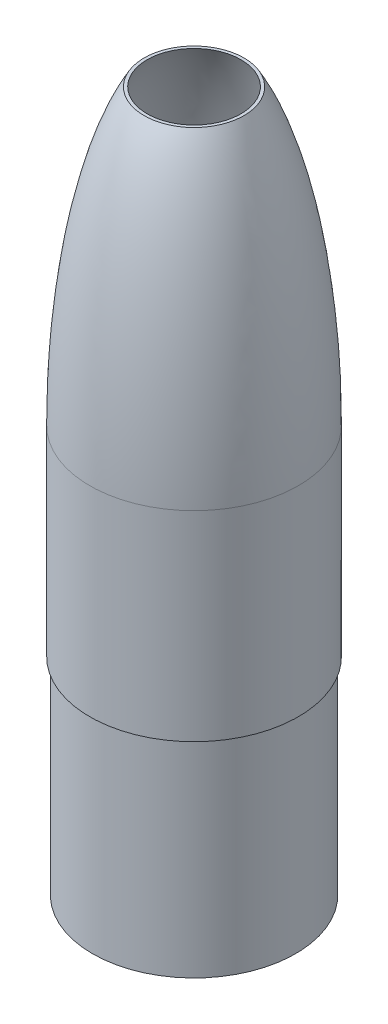
ISO-10303-21;
HEADER;
FILE_DESCRIPTION(('STEP AP214'),'2;1');
FILE_NAME('part.step','',(''),(''),'','','');
FILE_SCHEMA(('AUTOMOTIVE_DESIGN { 1 0 10303 214 1 1 1 1 }'));
ENDSEC;
DATA;
#1=APPLICATION_CONTEXT('core data for automotive mechanical design processes');
#2=APPLICATION_PROTOCOL_DEFINITION('international standard','automotive_design',2000,#1);
#3=PRODUCT_CONTEXT('',#1,'mechanical');
#4=PRODUCT('Part','Part','',(#3));
#5=PRODUCT_RELATED_PRODUCT_CATEGORY('part','',(#4));
#6=PRODUCT_DEFINITION_FORMATION('','',#4);
#7=PRODUCT_DEFINITION_CONTEXT('part definition',#1,'design');
#8=PRODUCT_DEFINITION('design','',#6,#7);
#9=PRODUCT_DEFINITION_SHAPE('','',#8);
#10=(LENGTH_UNIT() NAMED_UNIT(*) SI_UNIT(.MILLI.,.METRE.));
#11=(NAMED_UNIT(*) PLANE_ANGLE_UNIT() SI_UNIT($,.RADIAN.));
#12=(NAMED_UNIT(*) SI_UNIT($,.STERADIAN.) SOLID_ANGLE_UNIT());
#13=UNCERTAINTY_MEASURE_WITH_UNIT(LENGTH_MEASURE(1.E-05),#10,'distance_accuracy_value','');
#14=(GEOMETRIC_REPRESENTATION_CONTEXT(3) GLOBAL_UNCERTAINTY_ASSIGNED_CONTEXT((#13)) GLOBAL_UNIT_ASSIGNED_CONTEXT((#10,
#11,#12)) REPRESENTATION_CONTEXT('',''));
#15=CARTESIAN_POINT('',(0.,0.,0.));
#16=DIRECTION('',(0.,0.,1.));
#17=DIRECTION('',(1.,0.,0.));
#18=AXIS2_PLACEMENT_3D('',#15,#16,#17);
#19=CARTESIAN_POINT('',(78.16,150.,0.));
#20=CARTESIAN_POINT('',(78.16,158.124741440831,0.));
#21=CARTESIAN_POINT('',(77.9143964283696,174.415956202879,0.));
#22=CARTESIAN_POINT('',(76.8126900292029,198.585734280331,0.));
#23=CARTESIAN_POINT('',(74.987978239891,222.299614595278,0.));
#24=CARTESIAN_POINT('',(71.6143857103054,252.993821618781,0.));
#25=CARTESIAN_POINT('',(65.6897649255414,289.080732547851,0.));
#26=CARTESIAN_POINT('',(56.1093429123413,327.087146411559,0.));
#27=CARTESIAN_POINT('',(44.4035725024656,358.368758891952,0.));
#28=CARTESIAN_POINT('',(33.2071437767828,377.875372885673,0.));
#29=CARTESIAN_POINT('',(23.5506825278786,389.130576689322,0.));
#30=CARTESIAN_POINT('',(15.9852093641942,395.313409978409,0.));
#31=CARTESIAN_POINT('',(8.09536320832362,399.131102802521,0.));
#32=CARTESIAN_POINT('',(2.72314978418837,400.,0.));
#33=CARTESIAN_POINT('',(0.,400.,0.));
#34=B_SPLINE_CURVE_WITH_KNOTS('',3,(#19,#20,#21,#22,#23,#24,#25,#26,#27,#28,#29,#30,#31,#32,
#33),.UNSPECIFIED.,.F.,.F.,(4,1,1,1,1,1,1,1,1,1,1,1,4),(-1.5707963267949,-1.47262155637022,
-1.37444678594553,-1.27627201552085,-1.17809724509617,-0.98174770424681,-0.785398163397448,
-0.589048622548086,-0.392699081698724,-0.294524311274043,-0.196349540849362,-0.0981747704246811,
0.),.UNSPECIFIED.);
#35=CARTESIAN_POINT('',(0.,0.,0.));
#36=DIRECTION('',(0.,-1.,0.));
#37=AXIS1_PLACEMENT('',#35,#36);
#38=SURFACE_OF_REVOLUTION('',#34,#37);
#39=CARTESIAN_POINT('',(0.,370.,0.));
#40=DIRECTION('',(0.,-1.,0.));
#41=DIRECTION('',(0.,0.,-1.));
#42=AXIS2_PLACEMENT_3D('',#39,#40,#41);
#43=CIRCLE('',#42,37.4634477047783);
#44=CARTESIAN_POINT('',(0.,370.,-37.4634477047783));
#45=VERTEX_POINT('',#44);
#46=EDGE_CURVE('E97',#45,#45,#43,.F.);
#47=ORIENTED_EDGE('',*,*,#46,.F.);
#48=EDGE_LOOP('',(#47));
#49=FACE_BOUND('',#48,.T.);
#50=CARTESIAN_POINT('',(0.,150.,0.));
#51=DIRECTION('',(0.,-1.,0.));
#52=DIRECTION('',(0.,0.,-1.));
#53=AXIS2_PLACEMENT_3D('',#50,#51,#52);
#54=CIRCLE('',#53,78.16);
#55=CARTESIAN_POINT('',(0.,150.,-78.16));
#56=VERTEX_POINT('',#55);
#57=EDGE_CURVE('E46',#56,#56,#54,.T.);
#58=ORIENTED_EDGE('',*,*,#57,.F.);
#59=EDGE_LOOP('',(#58));
#60=FACE_BOUND('',#59,.T.);
#61=ADVANCED_FACE('F34',(#49,#60),#38,.F.);
#62=CARTESIAN_POINT('',(76.2,0.,0.));
#63=DIRECTION('',(0.,-1.,0.));
#64=DIRECTION('',(0.,0.,-1.));
#65=AXIS2_PLACEMENT_3D('',#62,#63,#64);
#66=PLANE('',#65);
#67=CARTESIAN_POINT('',(0.,0.,0.));
#68=DIRECTION('',(0.,-1.,0.));
#69=DIRECTION('',(0.,0.,-1.));
#70=AXIS2_PLACEMENT_3D('',#67,#68,#69);
#71=CIRCLE('',#70,78.16);
#72=CARTESIAN_POINT('',(0.,0.,-78.16));
#73=VERTEX_POINT('',#72);
#74=EDGE_CURVE('E42',#73,#73,#71,.T.);
#75=ORIENTED_EDGE('',*,*,#74,.T.);
#76=EDGE_LOOP('',(#75));
#77=FACE_BOUND('',#76,.T.);
#78=CARTESIAN_POINT('',(0.,0.,0.));
#79=DIRECTION('',(0.,-1.,0.));
#80=DIRECTION('',(0.,0.,-1.));
#81=AXIS2_PLACEMENT_3D('',#78,#79,#80);
#82=CIRCLE('',#81,76.2);
#83=CARTESIAN_POINT('',(0.,0.,76.2));
#84=VERTEX_POINT('',#83);
#85=EDGE_CURVE('E10',#84,#84,#82,.T.);
#86=ORIENTED_EDGE('',*,*,#85,.F.);
#87=EDGE_LOOP('',(#86));
#88=FACE_BOUND('',#87,.T.);
#89=ADVANCED_FACE('F63',(#77,#88),#66,.T.);
#90=CARTESIAN_POINT('',(0.,0.,0.));
#91=DIRECTION('',(0.,-1.,0.));
#92=DIRECTION('',(0.,0.,-1.));
#93=AXIS2_PLACEMENT_3D('',#90,#91,#92);
#94=CYLINDRICAL_SURFACE('',#93,78.16);
#95=ORIENTED_EDGE('',*,*,#57,.T.);
#96=EDGE_LOOP('',(#95));
#97=FACE_BOUND('',#96,.T.);
#98=ORIENTED_EDGE('',*,*,#74,.F.);
#99=EDGE_LOOP('',(#98));
#100=FACE_BOUND('',#99,.T.);
#101=ADVANCED_FACE('F66',(#97,#100),#94,.T.);
#102=CARTESIAN_POINT('',(0.,-154.8,0.));
#103=DIRECTION('',(0.,1.,0.));
#104=DIRECTION('',(0.,0.,1.));
#105=AXIS2_PLACEMENT_3D('',#102,#103,#104);
#106=CYLINDRICAL_SURFACE('',#105,76.2);
#107=CARTESIAN_POINT('',(0.,-154.8,0.));
#108=DIRECTION('',(0.,1.,0.));
#109=DIRECTION('',(0.,0.,1.));
#110=AXIS2_PLACEMENT_3D('',#107,#108,#109);
#111=CIRCLE('',#110,76.2);
#112=CARTESIAN_POINT('',(0.,-154.8,76.2));
#113=VERTEX_POINT('',#112);
#114=EDGE_CURVE('E51',#113,#113,#111,.T.);
#115=CARTESIAN_POINT('',(0.,0.,76.2));
#116=CARTESIAN_POINT('',(0.,-1.61249999999997,76.2));
#117=CARTESIAN_POINT('',(0.,-3.22499999999997,76.2));
#118=CARTESIAN_POINT('',(0.,-6.44999999999997,76.2));
#119=CARTESIAN_POINT('',(0.,-8.06249999999998,76.2));
#120=CARTESIAN_POINT('',(0.,-11.2875,76.2));
#121=CARTESIAN_POINT('',(0.,-12.9,76.2));
#122=CARTESIAN_POINT('',(0.,-16.125,76.2));
#123=CARTESIAN_POINT('',(0.,-17.7375,76.2));
#124=CARTESIAN_POINT('',(0.,-20.9625,76.2));
#125=CARTESIAN_POINT('',(0.,-22.575,76.2));
#126=CARTESIAN_POINT('',(0.,-25.8,76.2));
#127=CARTESIAN_POINT('',(0.,-27.4125,76.2));
#128=CARTESIAN_POINT('',(0.,-30.6375,76.2));
#129=CARTESIAN_POINT('',(0.,-32.25,76.2));
#130=CARTESIAN_POINT('',(0.,-35.475,76.2));
#131=CARTESIAN_POINT('',(0.,-37.0875,76.2));
#132=CARTESIAN_POINT('',(0.,-40.3125,76.2));
#133=CARTESIAN_POINT('',(0.,-41.925,76.2));
#134=CARTESIAN_POINT('',(0.,-45.15,76.2));
#135=CARTESIAN_POINT('',(0.,-46.7625,76.2));
#136=CARTESIAN_POINT('',(0.,-49.9875,76.2));
#137=CARTESIAN_POINT('',(0.,-51.6,76.2));
#138=CARTESIAN_POINT('',(0.,-54.825,76.2));
#139=CARTESIAN_POINT('',(0.,-56.4375,76.2));
#140=CARTESIAN_POINT('',(0.,-59.6625,76.2));
#141=CARTESIAN_POINT('',(0.,-61.275,76.2));
#142=CARTESIAN_POINT('',(0.,-64.5,76.2));
#143=CARTESIAN_POINT('',(0.,-66.1125,76.2));
#144=CARTESIAN_POINT('',(0.,-69.3375,76.2));
#145=CARTESIAN_POINT('',(0.,-70.95,76.2));
#146=CARTESIAN_POINT('',(0.,-74.175,76.2));
#147=CARTESIAN_POINT('',(0.,-75.7875,76.2));
#148=CARTESIAN_POINT('',(0.,-79.0125,76.2));
#149=CARTESIAN_POINT('',(0.,-80.625,76.2));
#150=CARTESIAN_POINT('',(0.,-83.85,76.2));
#151=CARTESIAN_POINT('',(0.,-85.4625,76.2));
#152=CARTESIAN_POINT('',(0.,-88.6875,76.2));
#153=CARTESIAN_POINT('',(0.,-90.3,76.2));
#154=CARTESIAN_POINT('',(0.,-93.525,76.2));
#155=CARTESIAN_POINT('',(0.,-95.1375,76.2));
#156=CARTESIAN_POINT('',(0.,-98.3625,76.2));
#157=CARTESIAN_POINT('',(0.,-99.975,76.2));
#158=CARTESIAN_POINT('',(0.,-103.2,76.2));
#159=CARTESIAN_POINT('',(0.,-104.8125,76.2));
#160=CARTESIAN_POINT('',(0.,-108.0375,76.2));
#161=CARTESIAN_POINT('',(0.,-109.65,76.2));
#162=CARTESIAN_POINT('',(0.,-112.875,76.2));
#163=CARTESIAN_POINT('',(0.,-114.4875,76.2));
#164=CARTESIAN_POINT('',(0.,-117.7125,76.2));
#165=CARTESIAN_POINT('',(0.,-119.325,76.2));
#166=CARTESIAN_POINT('',(0.,-122.55,76.2));
#167=CARTESIAN_POINT('',(0.,-124.1625,76.2));
#168=CARTESIAN_POINT('',(0.,-127.3875,76.2));
#169=CARTESIAN_POINT('',(0.,-129.,76.2));
#170=CARTESIAN_POINT('',(0.,-132.225,76.2));
#171=CARTESIAN_POINT('',(0.,-133.8375,76.2));
#172=CARTESIAN_POINT('',(0.,-137.0625,76.2));
#173=CARTESIAN_POINT('',(0.,-138.675,76.2));
#174=CARTESIAN_POINT('',(0.,-141.9,76.2));
#175=CARTESIAN_POINT('',(0.,-143.5125,76.2));
#176=CARTESIAN_POINT('',(0.,-146.7375,76.2));
#177=CARTESIAN_POINT('',(0.,-148.35,76.2));
#178=CARTESIAN_POINT('',(0.,-151.575,76.2));
#179=CARTESIAN_POINT('',(0.,-153.1875,76.2));
#180=CARTESIAN_POINT('',(0.,-154.8,76.2));
#181=B_SPLINE_CURVE_WITH_KNOTS('',3,(#115,#116,#117,#118,#119,#120,#121,#122,#123,#124,#125,
#126,#127,#128,#129,#130,#131,#132,#133,#134,#135,#136,#137,#138,#139,#140,#141,#142,#143,#144,
#145,#146,#147,#148,#149,#150,#151,#152,#153,#154,#155,#156,#157,#158,#159,#160,#161,#162,#163,
#164,#165,#166,#167,#168,#169,#170,#171,#172,#173,#174,#175,#176,#177,#178,#179,#180),
.UNSPECIFIED.,.F.,.F.,(4,2,2,2,2,2,2,2,2,2,2,2,2,2,2,2,2,2,2,2,2,2,2,2,2,2,2,2,2,2,2,2,4),(0.,
4.8375,9.67500000000002,14.5125,19.35,24.1875,29.025,33.8625,38.7,43.5375,48.375,53.2125,58.05,
62.8875,67.725,72.5625,77.4,82.2375,87.075,91.9125,96.75,101.5875,106.425,111.2625,116.1,
120.9375,125.775,130.6125,135.45,140.2875,145.125,149.9625,154.8),.UNSPECIFIED.);
#182=EDGE_CURVE('BSEAM70',#84,#113,#181,.T.);
#183=ORIENTED_EDGE('',*,*,#85,.T.);
#184=ORIENTED_EDGE('',*,*,#114,.T.);
#185=ORIENTED_EDGE('',*,*,#182,.T.);
#186=ORIENTED_EDGE('',*,*,#182,.F.);
#187=EDGE_LOOP('',(#183,#185,#184,#186));
#188=FACE_BOUND('',#187,.T.);
#189=ADVANCED_FACE('F70',(#188),#106,.T.);
#190=CARTESIAN_POINT('',(0.,-154.8,0.));
#191=DIRECTION('',(0.,1.,0.));
#192=DIRECTION('',(0.,0.,1.));
#193=AXIS2_PLACEMENT_3D('',#190,#191,#192);
#194=PLANE('',#193);
#195=CARTESIAN_POINT('',(0.,-154.8,0.));
#196=DIRECTION('',(0.,1.,0.));
#197=DIRECTION('',(0.,0.,1.));
#198=AXIS2_PLACEMENT_3D('',#195,#196,#197);
#199=CIRCLE('',#198,74.2);
#200=CARTESIAN_POINT('',(0.,-154.8,74.2));
#201=VERTEX_POINT('',#200);
#202=EDGE_CURVE('E105',#201,#201,#199,.T.);
#203=ORIENTED_EDGE('',*,*,#202,.T.);
#204=EDGE_LOOP('',(#203));
#205=FACE_BOUND('',#204,.T.);
#206=ORIENTED_EDGE('',*,*,#114,.F.);
#207=EDGE_LOOP('',(#206));
#208=FACE_BOUND('',#207,.T.);
#209=ADVANCED_FACE('F74',(#205,#208),#194,.F.);
#210=CARTESIAN_POINT('',(0.,150.,0.));
#211=DIRECTION('',(0.,1.,0.));
#212=DIRECTION('',(0.,0.,1.));
#213=AXIS2_PLACEMENT_3D('',#210,#211,#212);
#214=PLANE('',#213);
#215=CARTESIAN_POINT('',(0.,150.,0.));
#216=DIRECTION('',(0.,1.,0.));
#217=DIRECTION('',(0.,0.,1.));
#218=AXIS2_PLACEMENT_3D('',#215,#216,#217);
#219=CIRCLE('',#218,74.2);
#220=CARTESIAN_POINT('',(0.,150.,74.2));
#221=VERTEX_POINT('',#220);
#222=EDGE_CURVE('E102',#221,#221,#219,.T.);
#223=ORIENTED_EDGE('',*,*,#222,.F.);
#224=EDGE_LOOP('',(#223));
#225=FACE_BOUND('',#224,.T.);
#226=CARTESIAN_POINT('',(0.,150.,0.));
#227=DIRECTION('',(0.,1.,0.));
#228=DIRECTION('',(0.,0.,1.));
#229=AXIS2_PLACEMENT_3D('',#226,#227,#228);
#230=CIRCLE('',#229,76.2);
#231=CARTESIAN_POINT('',(0.,150.,76.2));
#232=VERTEX_POINT('',#231);
#233=EDGE_CURVE('E110',#232,#232,#230,.T.);
#234=ORIENTED_EDGE('',*,*,#233,.T.);
#235=EDGE_LOOP('',(#234));
#236=FACE_BOUND('',#235,.T.);
#237=ADVANCED_FACE('F75',(#225,#236),#214,.T.);
#238=CARTESIAN_POINT('',(0.,-154.8,0.));
#239=DIRECTION('',(0.,1.,0.));
#240=DIRECTION('',(0.,0.,1.));
#241=AXIS2_PLACEMENT_3D('',#238,#239,#240);
#242=CYLINDRICAL_SURFACE('',#241,74.2);
#243=CARTESIAN_POINT('',(0.,-154.8,74.2));
#244=CARTESIAN_POINT('',(0.,-151.625,74.2));
#245=CARTESIAN_POINT('',(0.,-148.45,74.2));
#246=CARTESIAN_POINT('',(0.,-142.1,74.2));
#247=CARTESIAN_POINT('',(0.,-138.925,74.2));
#248=CARTESIAN_POINT('',(0.,-132.575,74.2));
#249=CARTESIAN_POINT('',(0.,-129.4,74.2));
#250=CARTESIAN_POINT('',(0.,-123.05,74.2));
#251=CARTESIAN_POINT('',(0.,-119.875,74.2));
#252=CARTESIAN_POINT('',(0.,-113.525,74.2));
#253=CARTESIAN_POINT('',(0.,-110.35,74.2));
#254=CARTESIAN_POINT('',(0.,-104.,74.2));
#255=CARTESIAN_POINT('',(0.,-100.825,74.2));
#256=CARTESIAN_POINT('',(0.,-94.475,74.2));
#257=CARTESIAN_POINT('',(0.,-91.3,74.2));
#258=CARTESIAN_POINT('',(0.,-84.95,74.2));
#259=CARTESIAN_POINT('',(0.,-81.775,74.2));
#260=CARTESIAN_POINT('',(0.,-75.425,74.2));
#261=CARTESIAN_POINT('',(0.,-72.25,74.2));
#262=CARTESIAN_POINT('',(0.,-65.9,74.2));
#263=CARTESIAN_POINT('',(0.,-62.725,74.2));
#264=CARTESIAN_POINT('',(0.,-56.375,74.2));
#265=CARTESIAN_POINT('',(0.,-53.2,74.2));
#266=CARTESIAN_POINT('',(0.,-46.85,74.2));
#267=CARTESIAN_POINT('',(0.,-43.675,74.2));
#268=CARTESIAN_POINT('',(0.,-37.325,74.2));
#269=CARTESIAN_POINT('',(0.,-34.15,74.2));
#270=CARTESIAN_POINT('',(0.,-27.8,74.2));
#271=CARTESIAN_POINT('',(0.,-24.625,74.2));
#272=CARTESIAN_POINT('',(0.,-18.275,74.2));
#273=CARTESIAN_POINT('',(0.,-15.1,74.2));
#274=CARTESIAN_POINT('',(0.,-8.74999999999999,74.2));
#275=CARTESIAN_POINT('',(0.,-5.57499999999999,74.2));
#276=CARTESIAN_POINT('',(0.,0.775000000000017,74.2));
#277=CARTESIAN_POINT('',(0.,3.95000000000002,74.2));
#278=CARTESIAN_POINT('',(0.,10.3,74.2));
#279=CARTESIAN_POINT('',(0.,13.475,74.2));
#280=CARTESIAN_POINT('',(0.,19.825,74.2));
#281=CARTESIAN_POINT('',(0.,23.,74.2));
#282=CARTESIAN_POINT('',(0.,29.35,74.2));
#283=CARTESIAN_POINT('',(0.,32.525,74.2));
#284=CARTESIAN_POINT('',(0.,38.875,74.2));
#285=CARTESIAN_POINT('',(0.,42.05,74.2));
#286=CARTESIAN_POINT('',(0.,48.4,74.2));
#287=CARTESIAN_POINT('',(0.,51.575,74.2));
#288=CARTESIAN_POINT('',(0.,57.925,74.2));
#289=CARTESIAN_POINT('',(0.,61.1,74.2));
#290=CARTESIAN_POINT('',(0.,67.45,74.2));
#291=CARTESIAN_POINT('',(0.,70.625,74.2));
#292=CARTESIAN_POINT('',(0.,76.975,74.2));
#293=CARTESIAN_POINT('',(0.,80.15,74.2));
#294=CARTESIAN_POINT('',(0.,86.5,74.2));
#295=CARTESIAN_POINT('',(0.,89.675,74.2));
#296=CARTESIAN_POINT('',(0.,96.025,74.2));
#297=CARTESIAN_POINT('',(0.,99.2,74.2));
#298=CARTESIAN_POINT('',(0.,105.55,74.2));
#299=CARTESIAN_POINT('',(0.,108.725,74.2));
#300=CARTESIAN_POINT('',(0.,115.075,74.2));
#301=CARTESIAN_POINT('',(0.,118.25,74.2));
#302=CARTESIAN_POINT('',(0.,124.6,74.2));
#303=CARTESIAN_POINT('',(0.,127.775,74.2));
#304=CARTESIAN_POINT('',(0.,134.125,74.2));
#305=CARTESIAN_POINT('',(0.,137.3,74.2));
#306=CARTESIAN_POINT('',(0.,143.65,74.2));
#307=CARTESIAN_POINT('',(0.,146.825,74.2));
#308=CARTESIAN_POINT('',(0.,150.,74.2));
#309=B_SPLINE_CURVE_WITH_KNOTS('',3,(#243,#244,#245,#246,#247,#248,#249,#250,#251,#252,#253,
#254,#255,#256,#257,#258,#259,#260,#261,#262,#263,#264,#265,#266,#267,#268,#269,#270,#271,#272,
#273,#274,#275,#276,#277,#278,#279,#280,#281,#282,#283,#284,#285,#286,#287,#288,#289,#290,#291,
#292,#293,#294,#295,#296,#297,#298,#299,#300,#301,#302,#303,#304,#305,#306,#307,#308),
.UNSPECIFIED.,.F.,.F.,(4,2,2,2,2,2,2,2,2,2,2,2,2,2,2,2,2,2,2,2,2,2,2,2,2,2,2,2,2,2,2,2,4),(0.,
9.52499999999998,19.05,28.575,38.1,47.625,57.15,66.675,76.2,85.725,95.25,104.775,114.3,123.825,
133.35,142.875,152.4,161.925,171.45,180.975,190.5,200.025,209.55,219.075,228.6,238.125,247.65,
257.175,266.7,276.225,285.75,295.275,304.8),.UNSPECIFIED.);
#310=EDGE_CURVE('BSEAM61',#201,#221,#309,.T.);
#311=ORIENTED_EDGE('',*,*,#202,.F.);
#312=ORIENTED_EDGE('',*,*,#222,.T.);
#313=ORIENTED_EDGE('',*,*,#310,.T.);
#314=ORIENTED_EDGE('',*,*,#310,.F.);
#315=EDGE_LOOP('',(#311,#313,#312,#314));
#316=FACE_BOUND('',#315,.T.);
#317=ADVANCED_FACE('F61',(#316),#242,.F.);
#318=CARTESIAN_POINT('',(0.,150.,0.));
#319=DIRECTION('',(0.,0.,-1.));
#320=DIRECTION('',(0.,1.,0.));
#321=AXIS2_PLACEMENT_3D('',#318,#319,#320);
#322=ELLIPSE('',#321,248.04,76.2);
#323=TRIMMED_CURVE('',#322,(PARAMETER_VALUE(0.)),(PARAMETER_VALUE(3.14159265358979)),.T.,.PARAMETER.);
#324=CARTESIAN_POINT('',(0.,0.,0.));
#325=DIRECTION('',(0.,-1.,0.));
#326=AXIS1_PLACEMENT('',#324,#325);
#327=SURFACE_OF_REVOLUTION('',#323,#326);
#328=CARTESIAN_POINT('',(0.,370.,0.));
#329=DIRECTION('',(0.,-1.,0.));
#330=DIRECTION('',(0.,0.,-1.));
#331=AXIS2_PLACEMENT_3D('',#328,#329,#330);
#332=CIRCLE('',#331,35.1936036452897);
#333=CARTESIAN_POINT('',(0.,370.,-35.1936036452897));
#334=VERTEX_POINT('',#333);
#335=EDGE_CURVE('E38',#334,#334,#332,.T.);
#336=ORIENTED_EDGE('',*,*,#335,.F.);
#337=EDGE_LOOP('',(#336));
#338=FACE_BOUND('',#337,.T.);
#339=ORIENTED_EDGE('',*,*,#233,.F.);
#340=EDGE_LOOP('',(#339));
#341=FACE_BOUND('',#340,.T.);
#342=ADVANCED_FACE('F57',(#338,#341),#327,.F.);
#343=CARTESIAN_POINT('',(0.,370.,0.));
#344=DIRECTION('',(0.,-1.,0.));
#345=DIRECTION('',(0.,0.,-1.));
#346=AXIS2_PLACEMENT_3D('',#343,#344,#345);
#347=PLANE('',#346);
#348=ORIENTED_EDGE('',*,*,#46,.T.);
#349=EDGE_LOOP('',(#348));
#350=FACE_BOUND('',#349,.T.);
#351=ORIENTED_EDGE('',*,*,#335,.T.);
#352=EDGE_LOOP('',(#351));
#353=FACE_BOUND('',#352,.T.);
#354=ADVANCED_FACE('F60',(#350,#353),#347,.F.);
#355=CLOSED_SHELL('',(#61,#89,#101,#189,#209,#237,#317,#342,#354));
#356=MANIFOLD_SOLID_BREP('B2',#355);
#357=ADVANCED_BREP_SHAPE_REPRESENTATION('',(#18,#356),#14);
#358=SHAPE_DEFINITION_REPRESENTATION(#9,#357);
ENDSEC;
END-ISO-10303-21;
